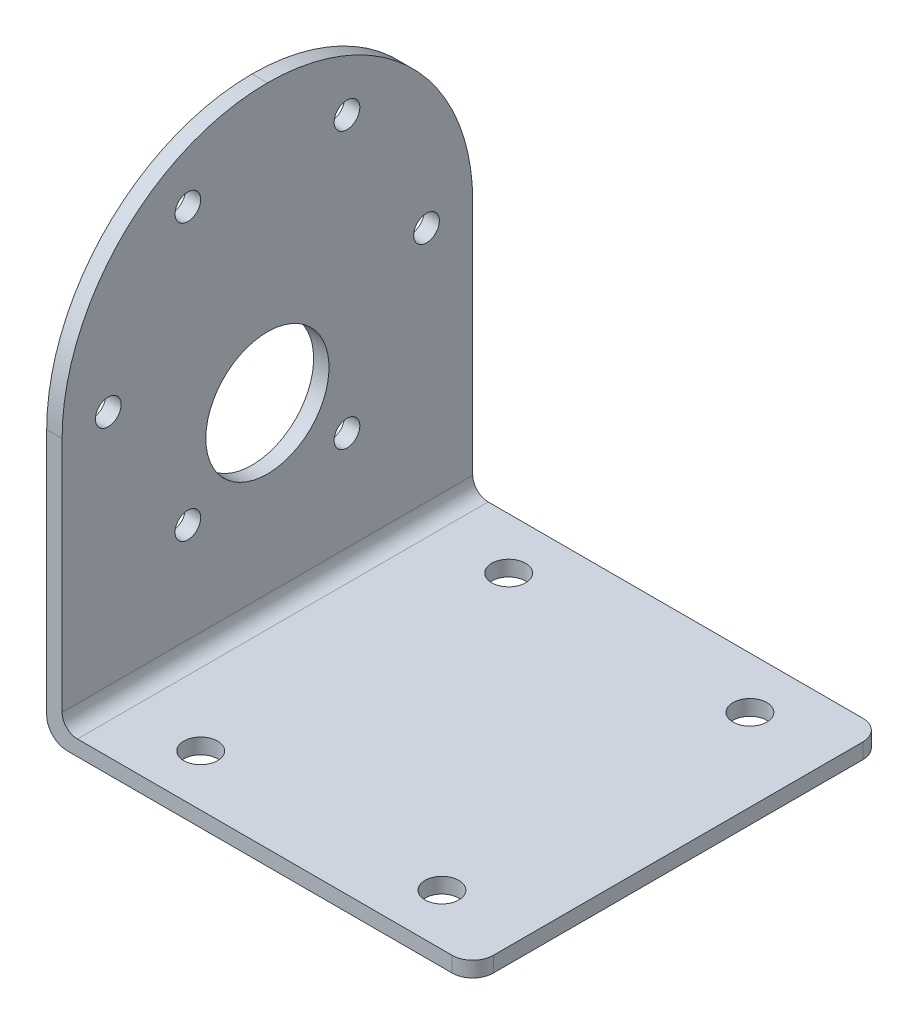
ISO-10303-21;
HEADER;
FILE_DESCRIPTION(('STEP AP214'),'2;1');
FILE_NAME('part.step','',(''),(''),'','','');
FILE_SCHEMA(('AUTOMOTIVE_DESIGN { 1 0 10303 214 1 1 1 1 }'));
ENDSEC;
DATA;
#1=APPLICATION_CONTEXT('core data for automotive mechanical design processes');
#2=APPLICATION_PROTOCOL_DEFINITION('international standard','automotive_design',2000,#1);
#3=PRODUCT_CONTEXT('',#1,'mechanical');
#4=PRODUCT('Part','Part','',(#3));
#5=PRODUCT_RELATED_PRODUCT_CATEGORY('part','',(#4));
#6=PRODUCT_DEFINITION_FORMATION('','',#4);
#7=PRODUCT_DEFINITION_CONTEXT('part definition',#1,'design');
#8=PRODUCT_DEFINITION('design','',#6,#7);
#9=PRODUCT_DEFINITION_SHAPE('','',#8);
#10=(LENGTH_UNIT() NAMED_UNIT(*) SI_UNIT(.MILLI.,.METRE.));
#11=(NAMED_UNIT(*) PLANE_ANGLE_UNIT() SI_UNIT($,.RADIAN.));
#12=(NAMED_UNIT(*) SI_UNIT($,.STERADIAN.) SOLID_ANGLE_UNIT());
#13=UNCERTAINTY_MEASURE_WITH_UNIT(LENGTH_MEASURE(1.E-05),#10,'distance_accuracy_value','');
#14=(GEOMETRIC_REPRESENTATION_CONTEXT(3) GLOBAL_UNCERTAINTY_ASSIGNED_CONTEXT((#13)) GLOBAL_UNIT_ASSIGNED_CONTEXT((#10,
#11,#12)) REPRESENTATION_CONTEXT('',''));
#15=CARTESIAN_POINT('',(0.,0.,0.));
#16=DIRECTION('',(0.,0.,1.));
#17=DIRECTION('',(1.,0.,0.));
#18=AXIS2_PLACEMENT_3D('',#15,#16,#17);
#19=CARTESIAN_POINT('',(-20.75,1.5,20.));
#20=DIRECTION('',(1.,0.,0.));
#21=DIRECTION('',(0.,0.,-1.));
#22=AXIS2_PLACEMENT_3D('',#19,#20,#21);
#23=PLANE('',#22);
#24=CARTESIAN_POINT('',(-20.75,12.6766062413412,-7.75000000000016));
#25=DIRECTION('',(-1.,0.,0.));
#26=DIRECTION('',(0.,0.,1.));
#27=AXIS2_PLACEMENT_3D('',#24,#25,#26);
#28=CIRCLE('',#27,1.25);
#29=CARTESIAN_POINT('',(-20.75,12.6766062413412,-6.50000000000016));
#30=VERTEX_POINT('',#29);
#31=EDGE_CURVE('E573',#30,#30,#28,.T.);
#32=ORIENTED_EDGE('',*,*,#31,.F.);
#33=EDGE_LOOP('',(#32));
#34=FACE_BOUND('',#33,.T.);
#35=CARTESIAN_POINT('',(-20.75,12.6766062413411,7.74999999999987));
#36=DIRECTION('',(-1.,0.,0.));
#37=DIRECTION('',(0.,0.,1.));
#38=AXIS2_PLACEMENT_3D('',#35,#36,#37);
#39=CIRCLE('',#38,1.25);
#40=CARTESIAN_POINT('',(-20.75,12.6766062413411,8.99999999999988));
#41=VERTEX_POINT('',#40);
#42=EDGE_CURVE('E586',#41,#41,#39,.T.);
#43=ORIENTED_EDGE('',*,*,#42,.F.);
#44=EDGE_LOOP('',(#43));
#45=FACE_BOUND('',#44,.T.);
#46=CARTESIAN_POINT('',(-20.75,26.0999999999998,15.5));
#47=DIRECTION('',(-1.,0.,0.));
#48=DIRECTION('',(0.,0.,1.));
#49=AXIS2_PLACEMENT_3D('',#46,#47,#48);
#50=CIRCLE('',#49,1.25);
#51=CARTESIAN_POINT('',(-20.75,26.0999999999998,16.75));
#52=VERTEX_POINT('',#51);
#53=EDGE_CURVE('E583',#52,#52,#50,.T.);
#54=ORIENTED_EDGE('',*,*,#53,.F.);
#55=EDGE_LOOP('',(#54));
#56=FACE_BOUND('',#55,.T.);
#57=CARTESIAN_POINT('',(-20.75,39.5233937586587,7.75000000000006));
#58=DIRECTION('',(-1.,0.,0.));
#59=DIRECTION('',(0.,0.,1.));
#60=AXIS2_PLACEMENT_3D('',#57,#58,#59);
#61=CIRCLE('',#60,1.25);
#62=CARTESIAN_POINT('',(-20.75,39.5233937586587,9.00000000000006));
#63=VERTEX_POINT('',#62);
#64=EDGE_CURVE('E580',#63,#63,#61,.T.);
#65=ORIENTED_EDGE('',*,*,#64,.F.);
#66=EDGE_LOOP('',(#65));
#67=FACE_BOUND('',#66,.T.);
#68=CARTESIAN_POINT('',(-20.75,39.5233937586587,-7.74999999999998));
#69=DIRECTION('',(-1.,0.,0.));
#70=DIRECTION('',(0.,0.,1.));
#71=AXIS2_PLACEMENT_3D('',#68,#69,#70);
#72=CIRCLE('',#71,1.25);
#73=CARTESIAN_POINT('',(-20.75,39.5233937586587,-6.49999999999998));
#74=VERTEX_POINT('',#73);
#75=EDGE_CURVE('E577',#74,#74,#72,.T.);
#76=ORIENTED_EDGE('',*,*,#75,.F.);
#77=EDGE_LOOP('',(#76));
#78=FACE_BOUND('',#77,.T.);
#79=CARTESIAN_POINT('',(-20.75,26.0999999999999,-15.5));
#80=DIRECTION('',(-1.,0.,0.));
#81=DIRECTION('',(0.,0.,1.));
#82=AXIS2_PLACEMENT_3D('',#79,#80,#81);
#83=CIRCLE('',#82,1.25);
#84=CARTESIAN_POINT('',(-20.75,26.0999999999999,-14.25));
#85=VERTEX_POINT('',#84);
#86=EDGE_CURVE('E574',#85,#85,#83,.T.);
#87=ORIENTED_EDGE('',*,*,#86,.F.);
#88=EDGE_LOOP('',(#87));
#89=FACE_BOUND('',#88,.T.);
#90=CARTESIAN_POINT('',(-20.75,19.1,0.));
#91=DIRECTION('',(-1.,0.,0.));
#92=DIRECTION('',(0.,0.,1.));
#93=AXIS2_PLACEMENT_3D('',#90,#91,#92);
#94=CIRCLE('',#93,6.);
#95=CARTESIAN_POINT('',(-20.75,19.1,6.));
#96=VERTEX_POINT('',#95);
#97=EDGE_CURVE('E161',#96,#96,#94,.T.);
#98=ORIENTED_EDGE('',*,*,#97,.F.);
#99=EDGE_LOOP('',(#98));
#100=FACE_BOUND('',#99,.T.);
#101=DIRECTION('',(0.,-1.,0.));
#102=VECTOR('',#101,1.);
#103=CARTESIAN_POINT('',(-20.75,1.5,-20.));
#104=LINE('',#103,#102);
#105=CARTESIAN_POINT('',(-20.75,26.1,-20.));
#106=VERTEX_POINT('',#105);
#107=CARTESIAN_POINT('',(-20.75,2.,-20.));
#108=VERTEX_POINT('',#107);
#109=EDGE_CURVE('E148',#106,#108,#104,.T.);
#110=ORIENTED_EDGE('',*,*,#109,.T.);
#111=DIRECTION('',(0.,0.,1.));
#112=VECTOR('',#111,1.);
#113=CARTESIAN_POINT('',(-20.75,2.,20.));
#114=LINE('',#113,#112);
#115=CARTESIAN_POINT('',(-20.75,2.,20.));
#116=VERTEX_POINT('',#115);
#117=EDGE_CURVE('E199',#108,#116,#114,.T.);
#118=ORIENTED_EDGE('',*,*,#117,.T.);
#119=DIRECTION('',(0.,-1.,0.));
#120=VECTOR('',#119,1.);
#121=CARTESIAN_POINT('',(-20.75,1.5,20.));
#122=LINE('',#121,#120);
#123=CARTESIAN_POINT('',(-20.75,26.1,20.));
#124=VERTEX_POINT('',#123);
#125=EDGE_CURVE('E138',#124,#116,#122,.T.);
#126=ORIENTED_EDGE('',*,*,#125,.F.);
#127=CARTESIAN_POINT('',(-20.75,26.1,0.));
#128=DIRECTION('',(1.,0.,0.));
#129=DIRECTION('',(0.,0.,-1.));
#130=AXIS2_PLACEMENT_3D('',#127,#128,#129);
#131=CIRCLE('',#130,20.);
#132=CARTESIAN_POINT('',(-20.75,46.1,0.));
#133=VERTEX_POINT('',#132);
#134=EDGE_CURVE('E132',#124,#133,#131,.F.);
#135=ORIENTED_EDGE('',*,*,#134,.T.);
#136=CARTESIAN_POINT('',(-20.75,26.1,0.));
#137=DIRECTION('',(1.,0.,0.));
#138=DIRECTION('',(0.,0.,-1.));
#139=AXIS2_PLACEMENT_3D('',#136,#137,#138);
#140=CIRCLE('',#139,20.);
#141=EDGE_CURVE('E122',#133,#106,#140,.F.);
#142=ORIENTED_EDGE('',*,*,#141,.T.);
#143=EDGE_LOOP('',(#110,#118,#126,#135,#142));
#144=FACE_BOUND('',#143,.T.);
#145=ADVANCED_FACE('F40',(#34,#45,#56,#67,#78,#89,#100,#144),#23,.F.);
#146=CARTESIAN_POINT('',(20.75,1.5,20.));
#147=DIRECTION('',(0.,0.,-1.));
#148=DIRECTION('',(-1.,0.,0.));
#149=AXIS2_PLACEMENT_3D('',#146,#147,#148);
#150=PLANE('',#149);
#151=ORIENTED_EDGE('',*,*,#125,.T.);
#152=CARTESIAN_POINT('',(-18.75,2.,20.));
#153=DIRECTION('',(0.,0.,-1.));
#154=DIRECTION('',(-1.,0.,0.));
#155=AXIS2_PLACEMENT_3D('',#152,#153,#154);
#156=CIRCLE('',#155,2.);
#157=CARTESIAN_POINT('',(-18.75,0.,20.));
#158=VERTEX_POINT('',#157);
#159=EDGE_CURVE('E201',#116,#158,#156,.F.);
#160=ORIENTED_EDGE('',*,*,#159,.T.);
#161=DIRECTION('',(1.,0.,0.));
#162=VECTOR('',#161,1.);
#163=CARTESIAN_POINT('',(20.75,0.,20.));
#164=LINE('',#163,#162);
#165=CARTESIAN_POINT('',(18.75,0.,20.));
#166=VERTEX_POINT('',#165);
#167=EDGE_CURVE('E222',#158,#166,#164,.T.);
#168=ORIENTED_EDGE('',*,*,#167,.T.);
#169=DIRECTION('',(0.,-1.,0.));
#170=VECTOR('',#169,1.);
#171=CARTESIAN_POINT('',(18.75,1.5,20.));
#172=LINE('',#171,#170);
#173=CARTESIAN_POINT('',(18.75,1.5,20.));
#174=VERTEX_POINT('',#173);
#175=EDGE_CURVE('E196',#166,#174,#172,.F.);
#176=ORIENTED_EDGE('',*,*,#175,.T.);
#177=DIRECTION('',(1.,0.,0.));
#178=VECTOR('',#177,1.);
#179=CARTESIAN_POINT('',(20.75,1.5,20.));
#180=LINE('',#179,#178);
#181=CARTESIAN_POINT('',(-17.75,1.5,20.));
#182=VERTEX_POINT('',#181);
#183=EDGE_CURVE('E227',#182,#174,#180,.T.);
#184=ORIENTED_EDGE('',*,*,#183,.F.);
#185=CARTESIAN_POINT('',(-17.75,3.,20.));
#186=DIRECTION('',(0.,0.,-1.));
#187=DIRECTION('',(-1.,0.,0.));
#188=AXIS2_PLACEMENT_3D('',#185,#186,#187);
#189=CIRCLE('',#188,1.5);
#190=CARTESIAN_POINT('',(-19.25,3.,20.));
#191=VERTEX_POINT('',#190);
#192=EDGE_CURVE('E11',#182,#191,#189,.T.);
#193=ORIENTED_EDGE('',*,*,#192,.T.);
#194=DIRECTION('',(0.,-1.,0.));
#195=VECTOR('',#194,1.);
#196=CARTESIAN_POINT('',(-19.25,46.1,20.));
#197=LINE('',#196,#195);
#198=CARTESIAN_POINT('',(-19.25,26.1,20.));
#199=VERTEX_POINT('',#198);
#200=EDGE_CURVE('E216',#199,#191,#197,.T.);
#201=ORIENTED_EDGE('',*,*,#200,.F.);
#202=DIRECTION('',(1.,0.,0.));
#203=VECTOR('',#202,1.);
#204=CARTESIAN_POINT('',(-20.75,26.1,20.));
#205=LINE('',#204,#203);
#206=EDGE_CURVE('E141',#199,#124,#205,.F.);
#207=ORIENTED_EDGE('',*,*,#206,.T.);
#208=EDGE_LOOP('',(#151,#160,#168,#176,#184,#193,#201,#207));
#209=FACE_BOUND('',#208,.T.);
#210=ADVANCED_FACE('F246',(#209),#150,.F.);
#211=CARTESIAN_POINT('',(20.75,1.5,20.));
#212=DIRECTION('',(-1.,0.,0.));
#213=DIRECTION('',(0.,0.,1.));
#214=AXIS2_PLACEMENT_3D('',#211,#212,#213);
#215=PLANE('',#214);
#216=DIRECTION('',(0.,0.,-1.));
#217=VECTOR('',#216,1.);
#218=CARTESIAN_POINT('',(20.75,0.,20.));
#219=LINE('',#218,#217);
#220=CARTESIAN_POINT('',(20.75,0.,18.));
#221=VERTEX_POINT('',#220);
#222=CARTESIAN_POINT('',(20.75,0.,-18.));
#223=VERTEX_POINT('',#222);
#224=EDGE_CURVE('E236',#221,#223,#219,.T.);
#225=ORIENTED_EDGE('',*,*,#224,.T.);
#226=DIRECTION('',(0.,-1.,0.));
#227=VECTOR('',#226,1.);
#228=CARTESIAN_POINT('',(20.75,1.5,-18.));
#229=LINE('',#228,#227);
#230=CARTESIAN_POINT('',(20.75,1.5,-18.));
#231=VERTEX_POINT('',#230);
#232=EDGE_CURVE('E190',#223,#231,#229,.F.);
#233=ORIENTED_EDGE('',*,*,#232,.T.);
#234=DIRECTION('',(0.,0.,-1.));
#235=VECTOR('',#234,1.);
#236=CARTESIAN_POINT('',(20.75,1.5,20.));
#237=LINE('',#236,#235);
#238=CARTESIAN_POINT('',(20.75,1.5,18.));
#239=VERTEX_POINT('',#238);
#240=EDGE_CURVE('E229',#239,#231,#237,.T.);
#241=ORIENTED_EDGE('',*,*,#240,.F.);
#242=DIRECTION('',(0.,-1.,0.));
#243=VECTOR('',#242,1.);
#244=CARTESIAN_POINT('',(20.75,1.5,18.));
#245=LINE('',#244,#243);
#246=EDGE_CURVE('E187',#239,#221,#245,.T.);
#247=ORIENTED_EDGE('',*,*,#246,.T.);
#248=EDGE_LOOP('',(#225,#233,#241,#247));
#249=FACE_BOUND('',#248,.T.);
#250=ADVANCED_FACE('F266',(#249),#215,.F.);
#251=CARTESIAN_POINT('',(20.75,1.5,-20.));
#252=DIRECTION('',(0.,0.,1.));
#253=DIRECTION('',(1.,0.,0.));
#254=AXIS2_PLACEMENT_3D('',#251,#252,#253);
#255=PLANE('',#254);
#256=DIRECTION('',(-1.,0.,0.));
#257=VECTOR('',#256,1.);
#258=CARTESIAN_POINT('',(20.75,0.,-20.));
#259=LINE('',#258,#257);
#260=CARTESIAN_POINT('',(18.75,0.,-20.));
#261=VERTEX_POINT('',#260);
#262=CARTESIAN_POINT('',(-18.75,0.,-20.));
#263=VERTEX_POINT('',#262);
#264=EDGE_CURVE('E230',#261,#263,#259,.T.);
#265=ORIENTED_EDGE('',*,*,#264,.T.);
#266=CARTESIAN_POINT('',(-18.75,2.,-20.));
#267=DIRECTION('',(0.,0.,1.));
#268=DIRECTION('',(1.,0.,0.));
#269=AXIS2_PLACEMENT_3D('',#266,#267,#268);
#270=CIRCLE('',#269,2.);
#271=EDGE_CURVE('E205',#263,#108,#270,.F.);
#272=ORIENTED_EDGE('',*,*,#271,.T.);
#273=ORIENTED_EDGE('',*,*,#109,.F.);
#274=DIRECTION('',(-1.,0.,0.));
#275=VECTOR('',#274,1.);
#276=CARTESIAN_POINT('',(-19.25,26.1,-20.));
#277=LINE('',#276,#275);
#278=CARTESIAN_POINT('',(-19.25,26.1,-20.));
#279=VERTEX_POINT('',#278);
#280=EDGE_CURVE('E128',#106,#279,#277,.F.);
#281=ORIENTED_EDGE('',*,*,#280,.T.);
#282=DIRECTION('',(0.,-1.,0.));
#283=VECTOR('',#282,1.);
#284=CARTESIAN_POINT('',(-19.25,46.1,-20.));
#285=LINE('',#284,#283);
#286=CARTESIAN_POINT('',(-19.25,3.,-20.));
#287=VERTEX_POINT('',#286);
#288=EDGE_CURVE('E179',#279,#287,#285,.T.);
#289=ORIENTED_EDGE('',*,*,#288,.T.);
#290=CARTESIAN_POINT('',(-17.75,3.,-20.));
#291=DIRECTION('',(0.,0.,1.));
#292=DIRECTION('',(1.,0.,0.));
#293=AXIS2_PLACEMENT_3D('',#290,#291,#292);
#294=CIRCLE('',#293,1.5);
#295=CARTESIAN_POINT('',(-17.75,1.5,-20.));
#296=VERTEX_POINT('',#295);
#297=EDGE_CURVE('E48',#287,#296,#294,.T.);
#298=ORIENTED_EDGE('',*,*,#297,.T.);
#299=DIRECTION('',(-1.,0.,0.));
#300=VECTOR('',#299,1.);
#301=CARTESIAN_POINT('',(20.75,1.5,-20.));
#302=LINE('',#301,#300);
#303=CARTESIAN_POINT('',(18.75,1.5,-20.));
#304=VERTEX_POINT('',#303);
#305=EDGE_CURVE('E233',#304,#296,#302,.T.);
#306=ORIENTED_EDGE('',*,*,#305,.F.);
#307=DIRECTION('',(0.,-1.,0.));
#308=VECTOR('',#307,1.);
#309=CARTESIAN_POINT('',(18.75,1.5,-20.));
#310=LINE('',#309,#308);
#311=EDGE_CURVE('E156',#304,#261,#310,.T.);
#312=ORIENTED_EDGE('',*,*,#311,.T.);
#313=EDGE_LOOP('',(#265,#272,#273,#281,#289,#298,#306,#312));
#314=FACE_BOUND('',#313,.T.);
#315=ADVANCED_FACE('F220',(#314),#255,.F.);
#316=CARTESIAN_POINT('',(0.,1.5,0.));
#317=DIRECTION('',(0.,1.,0.));
#318=DIRECTION('',(0.,0.,1.));
#319=AXIS2_PLACEMENT_3D('',#316,#317,#318);
#320=PLANE('',#319);
#321=CARTESIAN_POINT('',(12.7500000000003,1.5,-15.));
#322=DIRECTION('',(0.,1.,0.));
#323=DIRECTION('',(0.,0.,1.));
#324=AXIS2_PLACEMENT_3D('',#321,#322,#323);
#325=CIRCLE('',#324,1.65);
#326=CARTESIAN_POINT('',(12.7500000000003,1.5,-13.35));
#327=VERTEX_POINT('',#326);
#328=EDGE_CURVE('E570',#327,#327,#325,.T.);
#329=ORIENTED_EDGE('',*,*,#328,.F.);
#330=EDGE_LOOP('',(#329));
#331=FACE_BOUND('',#330,.T.);
#332=CARTESIAN_POINT('',(-10.7499999999997,1.5,-15.0000000000002));
#333=DIRECTION('',(0.,1.,0.));
#334=DIRECTION('',(0.,0.,1.));
#335=AXIS2_PLACEMENT_3D('',#332,#333,#334);
#336=CIRCLE('',#335,1.65);
#337=CARTESIAN_POINT('',(-10.7499999999997,1.5,-13.3500000000002));
#338=VERTEX_POINT('',#337);
#339=EDGE_CURVE('E567',#338,#338,#336,.T.);
#340=ORIENTED_EDGE('',*,*,#339,.F.);
#341=EDGE_LOOP('',(#340));
#342=FACE_BOUND('',#341,.T.);
#343=CARTESIAN_POINT('',(-10.75,1.5,14.9999999999998));
#344=DIRECTION('',(0.,1.,0.));
#345=DIRECTION('',(0.,0.,1.));
#346=AXIS2_PLACEMENT_3D('',#343,#344,#345);
#347=CIRCLE('',#346,1.65);
#348=CARTESIAN_POINT('',(-10.75,1.5,16.6499999999998));
#349=VERTEX_POINT('',#348);
#350=EDGE_CURVE('E559',#349,#349,#347,.T.);
#351=ORIENTED_EDGE('',*,*,#350,.F.);
#352=EDGE_LOOP('',(#351));
#353=FACE_BOUND('',#352,.T.);
#354=CARTESIAN_POINT('',(12.75,1.5,15.));
#355=DIRECTION('',(0.,1.,0.));
#356=DIRECTION('',(0.,0.,1.));
#357=AXIS2_PLACEMENT_3D('',#354,#355,#356);
#358=CIRCLE('',#357,1.65);
#359=CARTESIAN_POINT('',(12.75,1.5,16.65));
#360=VERTEX_POINT('',#359);
#361=EDGE_CURVE('E556',#360,#360,#358,.T.);
#362=ORIENTED_EDGE('',*,*,#361,.F.);
#363=EDGE_LOOP('',(#362));
#364=FACE_BOUND('',#363,.T.);
#365=ORIENTED_EDGE('',*,*,#305,.T.);
#366=DIRECTION('',(0.,0.,-1.));
#367=VECTOR('',#366,1.);
#368=CARTESIAN_POINT('',(-17.75,1.5,0.));
#369=LINE('',#368,#367);
#370=EDGE_CURVE('E55',#296,#182,#369,.F.);
#371=ORIENTED_EDGE('',*,*,#370,.T.);
#372=ORIENTED_EDGE('',*,*,#183,.T.);
#373=CARTESIAN_POINT('',(18.75,1.5,18.));
#374=DIRECTION('',(0.,1.,0.));
#375=DIRECTION('',(0.,0.,1.));
#376=AXIS2_PLACEMENT_3D('',#373,#374,#375);
#377=CIRCLE('',#376,2.);
#378=EDGE_CURVE('E192',#174,#239,#377,.T.);
#379=ORIENTED_EDGE('',*,*,#378,.T.);
#380=ORIENTED_EDGE('',*,*,#240,.T.);
#381=CARTESIAN_POINT('',(18.75,1.5,-18.));
#382=DIRECTION('',(0.,1.,0.));
#383=DIRECTION('',(0.,0.,1.));
#384=AXIS2_PLACEMENT_3D('',#381,#382,#383);
#385=CIRCLE('',#384,2.);
#386=EDGE_CURVE('E194',#231,#304,#385,.T.);
#387=ORIENTED_EDGE('',*,*,#386,.T.);
#388=EDGE_LOOP('',(#365,#371,#372,#379,#380,#387));
#389=FACE_BOUND('',#388,.T.);
#390=ADVANCED_FACE('F316',(#331,#342,#353,#364,#389),#320,.T.);
#391=CARTESIAN_POINT('',(0.,0.,0.));
#392=DIRECTION('',(0.,1.,0.));
#393=DIRECTION('',(0.,0.,1.));
#394=AXIS2_PLACEMENT_3D('',#391,#392,#393);
#395=PLANE('',#394);
#396=CARTESIAN_POINT('',(12.7500000000003,0.,-15.));
#397=DIRECTION('',(0.,-1.,0.));
#398=DIRECTION('',(0.,0.,-1.));
#399=AXIS2_PLACEMENT_3D('',#396,#397,#398);
#400=CIRCLE('',#399,1.65);
#401=CARTESIAN_POINT('',(12.7500000000003,0.,-16.65));
#402=VERTEX_POINT('',#401);
#403=EDGE_CURVE('E543',#402,#402,#400,.T.);
#404=ORIENTED_EDGE('',*,*,#403,.F.);
#405=EDGE_LOOP('',(#404));
#406=FACE_BOUND('',#405,.T.);
#407=CARTESIAN_POINT('',(-10.7499999999997,0.,-15.0000000000002));
#408=DIRECTION('',(0.,-1.,0.));
#409=DIRECTION('',(0.,0.,-1.));
#410=AXIS2_PLACEMENT_3D('',#407,#408,#409);
#411=CIRCLE('',#410,1.65);
#412=CARTESIAN_POINT('',(-10.7499999999997,0.,-16.6500000000002));
#413=VERTEX_POINT('',#412);
#414=EDGE_CURVE('E547',#413,#413,#411,.T.);
#415=ORIENTED_EDGE('',*,*,#414,.F.);
#416=EDGE_LOOP('',(#415));
#417=FACE_BOUND('',#416,.T.);
#418=CARTESIAN_POINT('',(-10.75,0.,14.9999999999998));
#419=DIRECTION('',(0.,-1.,0.));
#420=DIRECTION('',(0.,0.,-1.));
#421=AXIS2_PLACEMENT_3D('',#418,#419,#420);
#422=CIRCLE('',#421,1.65);
#423=CARTESIAN_POINT('',(-10.75,0.,13.3499999999998));
#424=VERTEX_POINT('',#423);
#425=EDGE_CURVE('E551',#424,#424,#422,.T.);
#426=ORIENTED_EDGE('',*,*,#425,.F.);
#427=EDGE_LOOP('',(#426));
#428=FACE_BOUND('',#427,.T.);
#429=CARTESIAN_POINT('',(12.75,0.,15.));
#430=DIRECTION('',(0.,-1.,0.));
#431=DIRECTION('',(0.,0.,-1.));
#432=AXIS2_PLACEMENT_3D('',#429,#430,#431);
#433=CIRCLE('',#432,1.65);
#434=CARTESIAN_POINT('',(12.75,0.,13.35));
#435=VERTEX_POINT('',#434);
#436=EDGE_CURVE('E554',#435,#435,#433,.T.);
#437=ORIENTED_EDGE('',*,*,#436,.F.);
#438=EDGE_LOOP('',(#437));
#439=FACE_BOUND('',#438,.T.);
#440=ORIENTED_EDGE('',*,*,#167,.F.);
#441=DIRECTION('',(0.,0.,1.));
#442=VECTOR('',#441,1.);
#443=CARTESIAN_POINT('',(-18.75,0.,0.));
#444=LINE('',#443,#442);
#445=EDGE_CURVE('E203',#158,#263,#444,.F.);
#446=ORIENTED_EDGE('',*,*,#445,.T.);
#447=ORIENTED_EDGE('',*,*,#264,.F.);
#448=CARTESIAN_POINT('',(18.75,0.,-18.));
#449=DIRECTION('',(0.,1.,0.));
#450=DIRECTION('',(0.,0.,1.));
#451=AXIS2_PLACEMENT_3D('',#448,#449,#450);
#452=CIRCLE('',#451,2.);
#453=EDGE_CURVE('E185',#261,#223,#452,.F.);
#454=ORIENTED_EDGE('',*,*,#453,.T.);
#455=ORIENTED_EDGE('',*,*,#224,.F.);
#456=CARTESIAN_POINT('',(18.75,0.,18.));
#457=DIRECTION('',(0.,1.,0.));
#458=DIRECTION('',(0.,0.,1.));
#459=AXIS2_PLACEMENT_3D('',#456,#457,#458);
#460=CIRCLE('',#459,2.);
#461=EDGE_CURVE('E182',#221,#166,#460,.F.);
#462=ORIENTED_EDGE('',*,*,#461,.T.);
#463=EDGE_LOOP('',(#440,#446,#447,#454,#455,#462));
#464=FACE_BOUND('',#463,.T.);
#465=ADVANCED_FACE('F248',(#406,#417,#428,#439,#464),#395,.F.);
#466=CARTESIAN_POINT('',(-19.25,46.1,-20.));
#467=DIRECTION('',(-1.,0.,0.));
#468=DIRECTION('',(0.,0.,1.));
#469=AXIS2_PLACEMENT_3D('',#466,#467,#468);
#470=PLANE('',#469);
#471=CARTESIAN_POINT('',(-19.25,12.6766062413412,-7.75000000000016));
#472=DIRECTION('',(-1.,0.,0.));
#473=DIRECTION('',(0.,0.,1.));
#474=AXIS2_PLACEMENT_3D('',#471,#472,#473);
#475=CIRCLE('',#474,1.25);
#476=CARTESIAN_POINT('',(-19.25,12.6766062413412,-6.50000000000016));
#477=VERTEX_POINT('',#476);
#478=EDGE_CURVE('E176',#477,#477,#475,.T.);
#479=ORIENTED_EDGE('',*,*,#478,.T.);
#480=EDGE_LOOP('',(#479));
#481=FACE_BOUND('',#480,.T.);
#482=CARTESIAN_POINT('',(-19.25,12.6766062413411,7.74999999999987));
#483=DIRECTION('',(-1.,0.,0.));
#484=DIRECTION('',(0.,0.,1.));
#485=AXIS2_PLACEMENT_3D('',#482,#483,#484);
#486=CIRCLE('',#485,1.25);
#487=CARTESIAN_POINT('',(-19.25,12.6766062413411,8.99999999999988));
#488=VERTEX_POINT('',#487);
#489=EDGE_CURVE('E173',#488,#488,#486,.T.);
#490=ORIENTED_EDGE('',*,*,#489,.T.);
#491=EDGE_LOOP('',(#490));
#492=FACE_BOUND('',#491,.T.);
#493=CARTESIAN_POINT('',(-19.25,26.0999999999998,15.5));
#494=DIRECTION('',(-1.,0.,0.));
#495=DIRECTION('',(0.,0.,1.));
#496=AXIS2_PLACEMENT_3D('',#493,#494,#495);
#497=CIRCLE('',#496,1.25);
#498=CARTESIAN_POINT('',(-19.25,26.0999999999998,16.75));
#499=VERTEX_POINT('',#498);
#500=EDGE_CURVE('E170',#499,#499,#497,.T.);
#501=ORIENTED_EDGE('',*,*,#500,.T.);
#502=EDGE_LOOP('',(#501));
#503=FACE_BOUND('',#502,.T.);
#504=CARTESIAN_POINT('',(-19.25,39.5233937586587,7.75000000000006));
#505=DIRECTION('',(-1.,0.,0.));
#506=DIRECTION('',(0.,0.,1.));
#507=AXIS2_PLACEMENT_3D('',#504,#505,#506);
#508=CIRCLE('',#507,1.25);
#509=CARTESIAN_POINT('',(-19.25,39.5233937586587,9.00000000000006));
#510=VERTEX_POINT('',#509);
#511=EDGE_CURVE('E167',#510,#510,#508,.T.);
#512=ORIENTED_EDGE('',*,*,#511,.T.);
#513=EDGE_LOOP('',(#512));
#514=FACE_BOUND('',#513,.T.);
#515=CARTESIAN_POINT('',(-19.25,39.5233937586587,-7.74999999999998));
#516=DIRECTION('',(-1.,0.,0.));
#517=DIRECTION('',(0.,0.,1.));
#518=AXIS2_PLACEMENT_3D('',#515,#516,#517);
#519=CIRCLE('',#518,1.25);
#520=CARTESIAN_POINT('',(-19.25,39.5233937586587,-6.49999999999998));
#521=VERTEX_POINT('',#520);
#522=EDGE_CURVE('E164',#521,#521,#519,.T.);
#523=ORIENTED_EDGE('',*,*,#522,.T.);
#524=EDGE_LOOP('',(#523));
#525=FACE_BOUND('',#524,.T.);
#526=CARTESIAN_POINT('',(-19.25,26.0999999999999,-15.5));
#527=DIRECTION('',(-1.,0.,0.));
#528=DIRECTION('',(0.,0.,1.));
#529=AXIS2_PLACEMENT_3D('',#526,#527,#528);
#530=CIRCLE('',#529,1.25);
#531=CARTESIAN_POINT('',(-19.25,26.0999999999999,-14.25));
#532=VERTEX_POINT('',#531);
#533=EDGE_CURVE('E160',#532,#532,#530,.T.);
#534=ORIENTED_EDGE('',*,*,#533,.T.);
#535=EDGE_LOOP('',(#534));
#536=FACE_BOUND('',#535,.T.);
#537=CARTESIAN_POINT('',(-19.25,19.1,0.));
#538=DIRECTION('',(-1.,0.,0.));
#539=DIRECTION('',(0.,0.,1.));
#540=AXIS2_PLACEMENT_3D('',#537,#538,#539);
#541=CIRCLE('',#540,6.);
#542=CARTESIAN_POINT('',(-19.25,19.1,6.));
#543=VERTEX_POINT('',#542);
#544=EDGE_CURVE('E157',#543,#543,#541,.T.);
#545=ORIENTED_EDGE('',*,*,#544,.T.);
#546=EDGE_LOOP('',(#545));
#547=FACE_BOUND('',#546,.T.);
#548=ORIENTED_EDGE('',*,*,#200,.T.);
#549=DIRECTION('',(0.,0.,-1.));
#550=VECTOR('',#549,1.);
#551=CARTESIAN_POINT('',(-19.25,3.,-20.));
#552=LINE('',#551,#550);
#553=EDGE_CURVE('E207',#191,#287,#552,.T.);
#554=ORIENTED_EDGE('',*,*,#553,.T.);
#555=ORIENTED_EDGE('',*,*,#288,.F.);
#556=CARTESIAN_POINT('',(-19.25,26.1,0.));
#557=DIRECTION('',(-1.,0.,0.));
#558=DIRECTION('',(0.,0.,1.));
#559=AXIS2_PLACEMENT_3D('',#556,#557,#558);
#560=CIRCLE('',#559,20.);
#561=CARTESIAN_POINT('',(-19.25,46.1,0.));
#562=VERTEX_POINT('',#561);
#563=EDGE_CURVE('E154',#279,#562,#560,.F.);
#564=ORIENTED_EDGE('',*,*,#563,.T.);
#565=CARTESIAN_POINT('',(-19.25,26.1,0.));
#566=DIRECTION('',(-1.,0.,0.));
#567=DIRECTION('',(0.,0.,1.));
#568=AXIS2_PLACEMENT_3D('',#565,#566,#567);
#569=CIRCLE('',#568,20.);
#570=EDGE_CURVE('E145',#562,#199,#569,.F.);
#571=ORIENTED_EDGE('',*,*,#570,.T.);
#572=EDGE_LOOP('',(#548,#554,#555,#564,#571));
#573=FACE_BOUND('',#572,.T.);
#574=ADVANCED_FACE('F214',(#481,#492,#503,#514,#525,#536,#547,#573),#470,.F.);
#575=CARTESIAN_POINT('',(0.,26.1,0.));
#576=DIRECTION('',(-1.,0.,0.));
#577=DIRECTION('',(0.,0.,1.));
#578=AXIS2_PLACEMENT_3D('',#575,#576,#577);
#579=CYLINDRICAL_SURFACE('',#578,20.);
#580=ORIENTED_EDGE('',*,*,#134,.F.);
#581=ORIENTED_EDGE('',*,*,#206,.F.);
#582=ORIENTED_EDGE('',*,*,#570,.F.);
#583=DIRECTION('',(1.,0.,0.));
#584=VECTOR('',#583,1.);
#585=CARTESIAN_POINT('',(-19.25,46.1,0.));
#586=LINE('',#585,#584);
#587=EDGE_CURVE('E127',#133,#562,#586,.T.);
#588=ORIENTED_EDGE('',*,*,#587,.F.);
#589=EDGE_LOOP('',(#580,#581,#582,#588));
#590=FACE_BOUND('',#589,.T.);
#591=ADVANCED_FACE('F144',(#590),#579,.T.);
#592=CARTESIAN_POINT('',(0.,26.1,0.));
#593=DIRECTION('',(1.,0.,0.));
#594=DIRECTION('',(0.,0.,-1.));
#595=AXIS2_PLACEMENT_3D('',#592,#593,#594);
#596=CYLINDRICAL_SURFACE('',#595,20.);
#597=ORIENTED_EDGE('',*,*,#563,.F.);
#598=ORIENTED_EDGE('',*,*,#280,.F.);
#599=ORIENTED_EDGE('',*,*,#141,.F.);
#600=ORIENTED_EDGE('',*,*,#587,.T.);
#601=EDGE_LOOP('',(#597,#598,#599,#600));
#602=FACE_BOUND('',#601,.T.);
#603=ADVANCED_FACE('F125',(#602),#596,.T.);
#604=CARTESIAN_POINT('',(23.85,19.1,0.));
#605=DIRECTION('',(-1.,0.,0.));
#606=DIRECTION('',(0.,0.,1.));
#607=AXIS2_PLACEMENT_3D('',#604,#605,#606);
#608=CYLINDRICAL_SURFACE('',#607,6.);
#609=ORIENTED_EDGE('',*,*,#97,.T.);
#610=EDGE_LOOP('',(#609));
#611=FACE_BOUND('',#610,.T.);
#612=ORIENTED_EDGE('',*,*,#544,.F.);
#613=EDGE_LOOP('',(#612));
#614=FACE_BOUND('',#613,.T.);
#615=ADVANCED_FACE('F276',(#611,#614),#608,.F.);
#616=CARTESIAN_POINT('',(23.85,26.0999999999999,-15.5));
#617=DIRECTION('',(-1.,0.,0.));
#618=DIRECTION('',(0.,0.,1.));
#619=AXIS2_PLACEMENT_3D('',#616,#617,#618);
#620=CYLINDRICAL_SURFACE('',#619,1.25);
#621=ORIENTED_EDGE('',*,*,#86,.T.);
#622=EDGE_LOOP('',(#621));
#623=FACE_BOUND('',#622,.T.);
#624=ORIENTED_EDGE('',*,*,#533,.F.);
#625=EDGE_LOOP('',(#624));
#626=FACE_BOUND('',#625,.T.);
#627=ADVANCED_FACE('F441',(#623,#626),#620,.F.);
#628=CARTESIAN_POINT('',(23.85,39.5233937586587,-7.74999999999998));
#629=DIRECTION('',(-1.,0.,0.));
#630=DIRECTION('',(0.,0.,1.));
#631=AXIS2_PLACEMENT_3D('',#628,#629,#630);
#632=CYLINDRICAL_SURFACE('',#631,1.25);
#633=ORIENTED_EDGE('',*,*,#75,.T.);
#634=EDGE_LOOP('',(#633));
#635=FACE_BOUND('',#634,.T.);
#636=ORIENTED_EDGE('',*,*,#522,.F.);
#637=EDGE_LOOP('',(#636));
#638=FACE_BOUND('',#637,.T.);
#639=ADVANCED_FACE('F431',(#635,#638),#632,.F.);
#640=CARTESIAN_POINT('',(23.85,39.5233937586587,7.75000000000006));
#641=DIRECTION('',(-1.,0.,0.));
#642=DIRECTION('',(0.,0.,1.));
#643=AXIS2_PLACEMENT_3D('',#640,#641,#642);
#644=CYLINDRICAL_SURFACE('',#643,1.25);
#645=ORIENTED_EDGE('',*,*,#64,.T.);
#646=EDGE_LOOP('',(#645));
#647=FACE_BOUND('',#646,.T.);
#648=ORIENTED_EDGE('',*,*,#511,.F.);
#649=EDGE_LOOP('',(#648));
#650=FACE_BOUND('',#649,.T.);
#651=ADVANCED_FACE('F421',(#647,#650),#644,.F.);
#652=CARTESIAN_POINT('',(23.85,26.0999999999998,15.5));
#653=DIRECTION('',(-1.,0.,0.));
#654=DIRECTION('',(0.,0.,1.));
#655=AXIS2_PLACEMENT_3D('',#652,#653,#654);
#656=CYLINDRICAL_SURFACE('',#655,1.25);
#657=ORIENTED_EDGE('',*,*,#53,.T.);
#658=EDGE_LOOP('',(#657));
#659=FACE_BOUND('',#658,.T.);
#660=ORIENTED_EDGE('',*,*,#500,.F.);
#661=EDGE_LOOP('',(#660));
#662=FACE_BOUND('',#661,.T.);
#663=ADVANCED_FACE('F411',(#659,#662),#656,.F.);
#664=CARTESIAN_POINT('',(23.85,12.6766062413411,7.74999999999987));
#665=DIRECTION('',(-1.,0.,0.));
#666=DIRECTION('',(0.,0.,1.));
#667=AXIS2_PLACEMENT_3D('',#664,#665,#666);
#668=CYLINDRICAL_SURFACE('',#667,1.25);
#669=ORIENTED_EDGE('',*,*,#42,.T.);
#670=EDGE_LOOP('',(#669));
#671=FACE_BOUND('',#670,.T.);
#672=ORIENTED_EDGE('',*,*,#489,.F.);
#673=EDGE_LOOP('',(#672));
#674=FACE_BOUND('',#673,.T.);
#675=ADVANCED_FACE('F401',(#671,#674),#668,.F.);
#676=CARTESIAN_POINT('',(23.85,12.6766062413412,-7.75000000000016));
#677=DIRECTION('',(-1.,0.,0.));
#678=DIRECTION('',(0.,0.,1.));
#679=AXIS2_PLACEMENT_3D('',#676,#677,#678);
#680=CYLINDRICAL_SURFACE('',#679,1.25);
#681=ORIENTED_EDGE('',*,*,#31,.T.);
#682=EDGE_LOOP('',(#681));
#683=FACE_BOUND('',#682,.T.);
#684=ORIENTED_EDGE('',*,*,#478,.F.);
#685=EDGE_LOOP('',(#684));
#686=FACE_BOUND('',#685,.T.);
#687=ADVANCED_FACE('F391',(#683,#686),#680,.F.);
#688=CARTESIAN_POINT('',(12.75,44.6,15.));
#689=DIRECTION('',(0.,-1.,0.));
#690=DIRECTION('',(0.,0.,-1.));
#691=AXIS2_PLACEMENT_3D('',#688,#689,#690);
#692=CYLINDRICAL_SURFACE('',#691,1.65);
#693=ORIENTED_EDGE('',*,*,#361,.T.);
#694=EDGE_LOOP('',(#693));
#695=FACE_BOUND('',#694,.T.);
#696=ORIENTED_EDGE('',*,*,#436,.T.);
#697=EDGE_LOOP('',(#696));
#698=FACE_BOUND('',#697,.T.);
#699=ADVANCED_FACE('F381',(#695,#698),#692,.F.);
#700=CARTESIAN_POINT('',(-10.75,44.6,14.9999999999998));
#701=DIRECTION('',(0.,-1.,0.));
#702=DIRECTION('',(0.,0.,-1.));
#703=AXIS2_PLACEMENT_3D('',#700,#701,#702);
#704=CYLINDRICAL_SURFACE('',#703,1.65);
#705=ORIENTED_EDGE('',*,*,#350,.T.);
#706=EDGE_LOOP('',(#705));
#707=FACE_BOUND('',#706,.T.);
#708=ORIENTED_EDGE('',*,*,#425,.T.);
#709=EDGE_LOOP('',(#708));
#710=FACE_BOUND('',#709,.T.);
#711=ADVANCED_FACE('F371',(#707,#710),#704,.F.);
#712=CARTESIAN_POINT('',(-10.7499999999997,44.6,-15.0000000000002));
#713=DIRECTION('',(0.,-1.,0.));
#714=DIRECTION('',(0.,0.,-1.));
#715=AXIS2_PLACEMENT_3D('',#712,#713,#714);
#716=CYLINDRICAL_SURFACE('',#715,1.65);
#717=ORIENTED_EDGE('',*,*,#339,.T.);
#718=EDGE_LOOP('',(#717));
#719=FACE_BOUND('',#718,.T.);
#720=ORIENTED_EDGE('',*,*,#414,.T.);
#721=EDGE_LOOP('',(#720));
#722=FACE_BOUND('',#721,.T.);
#723=ADVANCED_FACE('F361',(#719,#722),#716,.F.);
#724=CARTESIAN_POINT('',(12.7500000000003,44.6,-15.));
#725=DIRECTION('',(0.,-1.,0.));
#726=DIRECTION('',(0.,0.,-1.));
#727=AXIS2_PLACEMENT_3D('',#724,#725,#726);
#728=CYLINDRICAL_SURFACE('',#727,1.65);
#729=ORIENTED_EDGE('',*,*,#328,.T.);
#730=EDGE_LOOP('',(#729));
#731=FACE_BOUND('',#730,.T.);
#732=ORIENTED_EDGE('',*,*,#403,.T.);
#733=EDGE_LOOP('',(#732));
#734=FACE_BOUND('',#733,.T.);
#735=ADVANCED_FACE('F280',(#731,#734),#728,.F.);
#736=CARTESIAN_POINT('',(18.75,1.5,-18.));
#737=DIRECTION('',(0.,-1.,0.));
#738=DIRECTION('',(0.,0.,-1.));
#739=AXIS2_PLACEMENT_3D('',#736,#737,#738);
#740=CYLINDRICAL_SURFACE('',#739,2.);
#741=ORIENTED_EDGE('',*,*,#386,.F.);
#742=ORIENTED_EDGE('',*,*,#232,.F.);
#743=ORIENTED_EDGE('',*,*,#453,.F.);
#744=ORIENTED_EDGE('',*,*,#311,.F.);
#745=EDGE_LOOP('',(#741,#742,#743,#744));
#746=FACE_BOUND('',#745,.T.);
#747=ADVANCED_FACE('F277',(#746),#740,.T.);
#748=CARTESIAN_POINT('',(18.75,1.5,18.));
#749=DIRECTION('',(0.,-1.,0.));
#750=DIRECTION('',(0.,0.,-1.));
#751=AXIS2_PLACEMENT_3D('',#748,#749,#750);
#752=CYLINDRICAL_SURFACE('',#751,2.);
#753=ORIENTED_EDGE('',*,*,#378,.F.);
#754=ORIENTED_EDGE('',*,*,#175,.F.);
#755=ORIENTED_EDGE('',*,*,#461,.F.);
#756=ORIENTED_EDGE('',*,*,#246,.F.);
#757=EDGE_LOOP('',(#753,#754,#755,#756));
#758=FACE_BOUND('',#757,.T.);
#759=ADVANCED_FACE('F255',(#758),#752,.T.);
#760=CARTESIAN_POINT('',(-18.75,2.,20.));
#761=DIRECTION('',(0.,0.,1.));
#762=DIRECTION('',(1.,0.,0.));
#763=AXIS2_PLACEMENT_3D('',#760,#761,#762);
#764=CYLINDRICAL_SURFACE('',#763,2.);
#765=ORIENTED_EDGE('',*,*,#271,.F.);
#766=ORIENTED_EDGE('',*,*,#445,.F.);
#767=ORIENTED_EDGE('',*,*,#159,.F.);
#768=ORIENTED_EDGE('',*,*,#117,.F.);
#769=EDGE_LOOP('',(#765,#766,#767,#768));
#770=FACE_BOUND('',#769,.T.);
#771=ADVANCED_FACE('F242',(#770),#764,.T.);
#772=CARTESIAN_POINT('',(-17.75,3.,-20.));
#773=DIRECTION('',(0.,0.,-1.));
#774=DIRECTION('',(-1.,0.,0.));
#775=AXIS2_PLACEMENT_3D('',#772,#773,#774);
#776=CYLINDRICAL_SURFACE('',#775,1.5);
#777=ORIENTED_EDGE('',*,*,#192,.F.);
#778=ORIENTED_EDGE('',*,*,#370,.F.);
#779=ORIENTED_EDGE('',*,*,#297,.F.);
#780=ORIENTED_EDGE('',*,*,#553,.F.);
#781=EDGE_LOOP('',(#777,#778,#779,#780));
#782=FACE_BOUND('',#781,.T.);
#783=ADVANCED_FACE('F42',(#782),#776,.F.);
#784=CLOSED_SHELL('',(#145,#210,#250,#315,#390,#465,#574,#591,#603,#615,#627,#639,#651,#663,
#675,#687,#699,#711,#723,#735,#747,#759,#771,#783));
#785=MANIFOLD_SOLID_BREP('B2',#784);
#786=ADVANCED_BREP_SHAPE_REPRESENTATION('',(#18,#785),#14);
#787=SHAPE_DEFINITION_REPRESENTATION(#9,#786);
ENDSEC;
END-ISO-10303-21;
